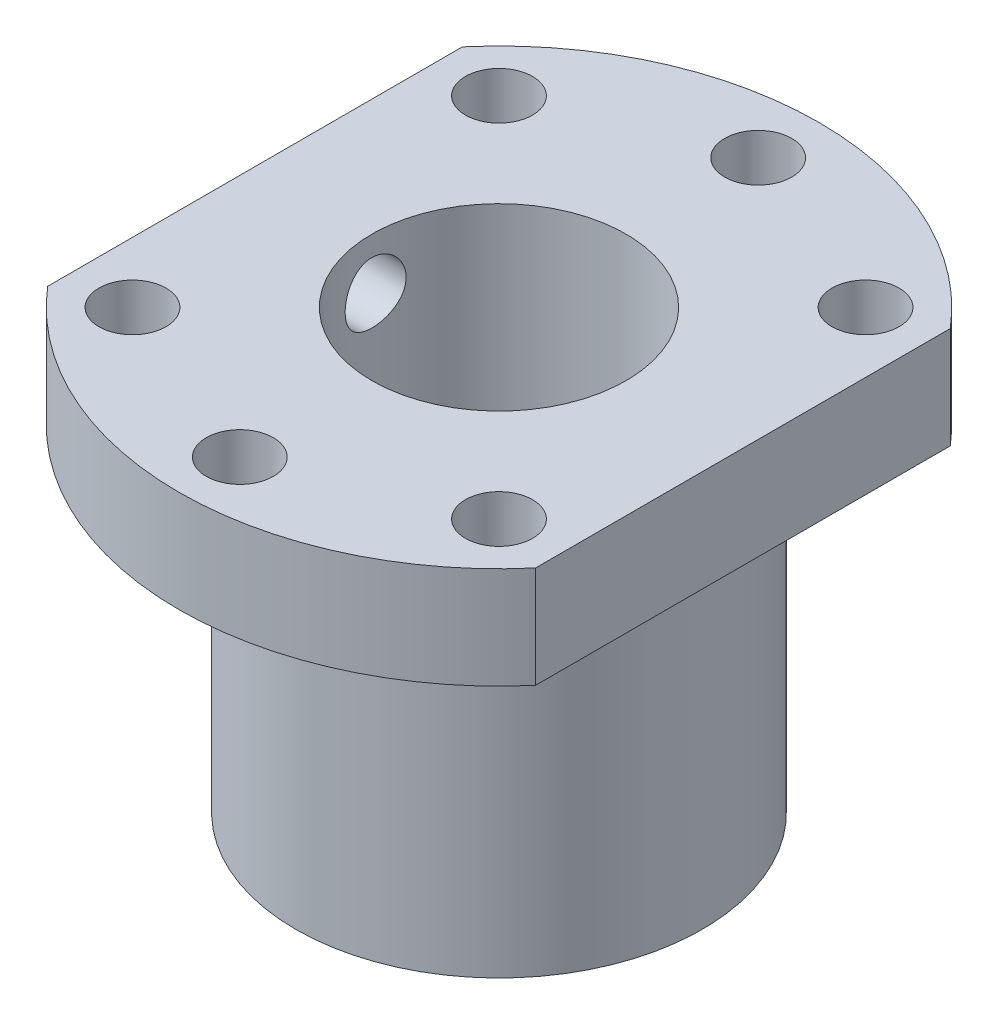
ISO-10303-21;
HEADER;
FILE_DESCRIPTION(('STEP AP214'),'2;1');
FILE_NAME('part.step','',(''),(''),'','','');
FILE_SCHEMA(('AUTOMOTIVE_DESIGN { 1 0 10303 214 1 1 1 1 }'));
ENDSEC;
DATA;
#1=APPLICATION_CONTEXT('core data for automotive mechanical design processes');
#2=APPLICATION_PROTOCOL_DEFINITION('international standard','automotive_design',2000,#1);
#3=PRODUCT_CONTEXT('',#1,'mechanical');
#4=PRODUCT('Part','Part','',(#3));
#5=PRODUCT_RELATED_PRODUCT_CATEGORY('part','',(#4));
#6=PRODUCT_DEFINITION_FORMATION('','',#4);
#7=PRODUCT_DEFINITION_CONTEXT('part definition',#1,'design');
#8=PRODUCT_DEFINITION('design','',#6,#7);
#9=PRODUCT_DEFINITION_SHAPE('','',#8);
#10=(LENGTH_UNIT() NAMED_UNIT(*) SI_UNIT(.MILLI.,.METRE.));
#11=(NAMED_UNIT(*) PLANE_ANGLE_UNIT() SI_UNIT($,.RADIAN.));
#12=(NAMED_UNIT(*) SI_UNIT($,.STERADIAN.) SOLID_ANGLE_UNIT());
#13=UNCERTAINTY_MEASURE_WITH_UNIT(LENGTH_MEASURE(1.E-05),#10,'distance_accuracy_value','');
#14=(GEOMETRIC_REPRESENTATION_CONTEXT(3) GLOBAL_UNCERTAINTY_ASSIGNED_CONTEXT((#13)) GLOBAL_UNIT_ASSIGNED_CONTEXT((#10,
#11,#12)) REPRESENTATION_CONTEXT('',''));
#15=CARTESIAN_POINT('',(0.,0.,0.));
#16=DIRECTION('',(0.,0.,1.));
#17=DIRECTION('',(1.,0.,0.));
#18=AXIS2_PLACEMENT_3D('',#15,#16,#17);
#19=CARTESIAN_POINT('',(0.,-10.,0.));
#20=DIRECTION('',(0.,1.,0.));
#21=DIRECTION('',(0.,0.,1.));
#22=AXIS2_PLACEMENT_3D('',#19,#20,#21);
#23=CYLINDRICAL_SURFACE('',#22,31.5);
#24=CARTESIAN_POINT('',(0.,0.,0.));
#25=DIRECTION('',(0.,1.,0.));
#26=DIRECTION('',(0.,0.,1.));
#27=AXIS2_PLACEMENT_3D('',#24,#25,#26);
#28=CIRCLE('',#27,31.5);
#29=CARTESIAN_POINT('',(24.,0.,-20.4022057631032));
#30=VERTEX_POINT('',#29);
#31=CARTESIAN_POINT('',(-24.,0.,-20.4022057631032));
#32=VERTEX_POINT('',#31);
#33=EDGE_CURVE('E106',#30,#32,#28,.T.);
#34=ORIENTED_EDGE('',*,*,#33,.F.);
#35=DIRECTION('',(0.,1.,0.));
#36=VECTOR('',#35,1.);
#37=CARTESIAN_POINT('',(24.,-10.,-20.4022057631032));
#38=LINE('',#37,#36);
#39=CARTESIAN_POINT('',(24.,-10.,-20.4022057631032));
#40=VERTEX_POINT('',#39);
#41=EDGE_CURVE('E11',#40,#30,#38,.T.);
#42=ORIENTED_EDGE('',*,*,#41,.F.);
#43=CARTESIAN_POINT('',(0.,-10.,0.));
#44=DIRECTION('',(0.,1.,0.));
#45=DIRECTION('',(0.,0.,1.));
#46=AXIS2_PLACEMENT_3D('',#43,#44,#45);
#47=CIRCLE('',#46,31.5);
#48=CARTESIAN_POINT('',(-24.,-10.,-20.4022057631032));
#49=VERTEX_POINT('',#48);
#50=EDGE_CURVE('E99',#40,#49,#47,.T.);
#51=ORIENTED_EDGE('',*,*,#50,.T.);
#52=DIRECTION('',(0.,1.,0.));
#53=VECTOR('',#52,1.);
#54=CARTESIAN_POINT('',(-24.,-10.,-20.4022057631032));
#55=LINE('',#54,#53);
#56=EDGE_CURVE('E82',#49,#32,#55,.T.);
#57=ORIENTED_EDGE('',*,*,#56,.T.);
#58=EDGE_LOOP('',(#34,#42,#51,#57));
#59=FACE_BOUND('',#58,.T.);
#60=ADVANCED_FACE('F34',(#59),#23,.T.);
#61=CARTESIAN_POINT('',(24.,-10.,-20.4022057631032));
#62=DIRECTION('',(1.,0.,0.));
#63=DIRECTION('',(0.,0.,-1.));
#64=AXIS2_PLACEMENT_3D('',#61,#62,#63);
#65=PLANE('',#64);
#66=DIRECTION('',(0.,0.,-1.));
#67=VECTOR('',#66,1.);
#68=CARTESIAN_POINT('',(24.,0.,-20.4022057631032));
#69=LINE('',#68,#67);
#70=CARTESIAN_POINT('',(24.,0.,20.4022057631032));
#71=VERTEX_POINT('',#70);
#72=EDGE_CURVE('E101',#71,#30,#69,.T.);
#73=ORIENTED_EDGE('',*,*,#72,.F.);
#74=DIRECTION('',(0.,1.,0.));
#75=VECTOR('',#74,1.);
#76=CARTESIAN_POINT('',(24.,-10.,20.4022057631032));
#77=LINE('',#76,#75);
#78=CARTESIAN_POINT('',(24.,-10.,20.4022057631032));
#79=VERTEX_POINT('',#78);
#80=EDGE_CURVE('E48',#79,#71,#77,.T.);
#81=ORIENTED_EDGE('',*,*,#80,.F.);
#82=DIRECTION('',(0.,0.,-1.));
#83=VECTOR('',#82,1.);
#84=CARTESIAN_POINT('',(24.,-10.,-20.4022057631032));
#85=LINE('',#84,#83);
#86=EDGE_CURVE('E96',#79,#40,#85,.T.);
#87=ORIENTED_EDGE('',*,*,#86,.T.);
#88=ORIENTED_EDGE('',*,*,#41,.T.);
#89=EDGE_LOOP('',(#73,#81,#87,#88));
#90=FACE_BOUND('',#89,.T.);
#91=ADVANCED_FACE('F118',(#90),#65,.T.);
#92=CARTESIAN_POINT('',(0.,-10.,0.));
#93=DIRECTION('',(0.,1.,0.));
#94=DIRECTION('',(0.,0.,1.));
#95=AXIS2_PLACEMENT_3D('',#92,#93,#94);
#96=CYLINDRICAL_SURFACE('',#95,31.5);
#97=CARTESIAN_POINT('',(0.,0.,0.));
#98=DIRECTION('',(0.,1.,0.));
#99=DIRECTION('',(0.,0.,1.));
#100=AXIS2_PLACEMENT_3D('',#97,#98,#99);
#101=CIRCLE('',#100,31.5);
#102=CARTESIAN_POINT('',(-24.,0.,20.4022057631032));
#103=VERTEX_POINT('',#102);
#104=EDGE_CURVE('E90',#103,#71,#101,.T.);
#105=ORIENTED_EDGE('',*,*,#104,.F.);
#106=DIRECTION('',(0.,1.,0.));
#107=VECTOR('',#106,1.);
#108=CARTESIAN_POINT('',(-24.,-10.,20.4022057631032));
#109=LINE('',#108,#107);
#110=CARTESIAN_POINT('',(-24.,-10.,20.4022057631032));
#111=VERTEX_POINT('',#110);
#112=EDGE_CURVE('E85',#111,#103,#109,.T.);
#113=ORIENTED_EDGE('',*,*,#112,.F.);
#114=CARTESIAN_POINT('',(0.,-10.,0.));
#115=DIRECTION('',(0.,1.,0.));
#116=DIRECTION('',(0.,0.,1.));
#117=AXIS2_PLACEMENT_3D('',#114,#115,#116);
#118=CIRCLE('',#117,31.5);
#119=EDGE_CURVE('E88',#111,#79,#118,.T.);
#120=ORIENTED_EDGE('',*,*,#119,.T.);
#121=ORIENTED_EDGE('',*,*,#80,.T.);
#122=EDGE_LOOP('',(#105,#113,#120,#121));
#123=FACE_BOUND('',#122,.T.);
#124=ADVANCED_FACE('F87',(#123),#96,.T.);
#125=CARTESIAN_POINT('',(-24.,-10.,-20.4022057631032));
#126=DIRECTION('',(-1.,0.,0.));
#127=DIRECTION('',(0.,0.,1.));
#128=AXIS2_PLACEMENT_3D('',#125,#126,#127);
#129=PLANE('',#128);
#130=CARTESIAN_POINT('',(-24.,-5.,0.));
#131=DIRECTION('',(1.,0.,0.));
#132=DIRECTION('',(0.,0.,-1.));
#133=AXIS2_PLACEMENT_3D('',#130,#131,#132);
#134=CIRCLE('',#133,3.);
#135=CARTESIAN_POINT('',(-24.,-5.,-3.));
#136=VERTEX_POINT('',#135);
#137=EDGE_CURVE('E136',#136,#136,#134,.T.);
#138=ORIENTED_EDGE('',*,*,#137,.T.);
#139=EDGE_LOOP('',(#138));
#140=FACE_BOUND('',#139,.T.);
#141=DIRECTION('',(0.,0.,1.));
#142=VECTOR('',#141,1.);
#143=CARTESIAN_POINT('',(-24.,0.,-20.4022057631032));
#144=LINE('',#143,#142);
#145=EDGE_CURVE('E109',#32,#103,#144,.T.);
#146=ORIENTED_EDGE('',*,*,#145,.F.);
#147=ORIENTED_EDGE('',*,*,#56,.F.);
#148=DIRECTION('',(0.,0.,1.));
#149=VECTOR('',#148,1.);
#150=CARTESIAN_POINT('',(-24.,-10.,-20.4022057631032));
#151=LINE('',#150,#149);
#152=EDGE_CURVE('E95',#49,#111,#151,.T.);
#153=ORIENTED_EDGE('',*,*,#152,.T.);
#154=ORIENTED_EDGE('',*,*,#112,.T.);
#155=EDGE_LOOP('',(#146,#147,#153,#154));
#156=FACE_BOUND('',#155,.T.);
#157=ADVANCED_FACE('F98',(#140,#156),#129,.T.);
#158=CARTESIAN_POINT('',(0.,-10.,0.));
#159=DIRECTION('',(0.,1.,0.));
#160=DIRECTION('',(0.,0.,1.));
#161=AXIS2_PLACEMENT_3D('',#158,#159,#160);
#162=PLANE('',#161);
#163=CARTESIAN_POINT('',(0.,-10.,-25.5));
#164=DIRECTION('',(0.,1.,0.));
#165=DIRECTION('',(0.,0.,1.));
#166=AXIS2_PLACEMENT_3D('',#163,#164,#165);
#167=CIRCLE('',#166,3.3);
#168=CARTESIAN_POINT('',(0.,-10.,-22.2));
#169=VERTEX_POINT('',#168);
#170=EDGE_CURVE('E174',#169,#169,#167,.T.);
#171=ORIENTED_EDGE('',*,*,#170,.T.);
#172=EDGE_LOOP('',(#171));
#173=FACE_BOUND('',#172,.T.);
#174=CARTESIAN_POINT('',(-18.031222920257,-10.,-18.0312229202569));
#175=DIRECTION('',(0.,1.,0.));
#176=DIRECTION('',(0.,0.,1.));
#177=AXIS2_PLACEMENT_3D('',#174,#175,#176);
#178=CIRCLE('',#177,3.3);
#179=CARTESIAN_POINT('',(-18.031222920257,-10.,-14.7312229202569));
#180=VERTEX_POINT('',#179);
#181=EDGE_CURVE('E171',#180,#180,#178,.T.);
#182=ORIENTED_EDGE('',*,*,#181,.T.);
#183=EDGE_LOOP('',(#182));
#184=FACE_BOUND('',#183,.T.);
#185=CARTESIAN_POINT('',(18.031222920257,-10.,-18.0312229202569));
#186=DIRECTION('',(0.,1.,0.));
#187=DIRECTION('',(0.,0.,1.));
#188=AXIS2_PLACEMENT_3D('',#185,#186,#187);
#189=CIRCLE('',#188,3.3);
#190=CARTESIAN_POINT('',(18.031222920257,-10.,-14.7312229202569));
#191=VERTEX_POINT('',#190);
#192=EDGE_CURVE('E168',#191,#191,#189,.T.);
#193=ORIENTED_EDGE('',*,*,#192,.T.);
#194=EDGE_LOOP('',(#193));
#195=FACE_BOUND('',#194,.T.);
#196=CARTESIAN_POINT('',(18.031222920257,-10.,18.0312229202569));
#197=DIRECTION('',(0.,1.,0.));
#198=DIRECTION('',(0.,0.,1.));
#199=AXIS2_PLACEMENT_3D('',#196,#197,#198);
#200=CIRCLE('',#199,3.3);
#201=CARTESIAN_POINT('',(18.031222920257,-10.,21.3312229202569));
#202=VERTEX_POINT('',#201);
#203=EDGE_CURVE('E165',#202,#202,#200,.T.);
#204=ORIENTED_EDGE('',*,*,#203,.T.);
#205=EDGE_LOOP('',(#204));
#206=FACE_BOUND('',#205,.T.);
#207=CARTESIAN_POINT('',(-18.031222920257,-10.,18.0312229202569));
#208=DIRECTION('',(0.,1.,0.));
#209=DIRECTION('',(0.,0.,1.));
#210=AXIS2_PLACEMENT_3D('',#207,#208,#209);
#211=CIRCLE('',#210,3.3);
#212=CARTESIAN_POINT('',(-18.031222920257,-10.,21.3312229202569));
#213=VERTEX_POINT('',#212);
#214=EDGE_CURVE('E162',#213,#213,#211,.T.);
#215=ORIENTED_EDGE('',*,*,#214,.T.);
#216=EDGE_LOOP('',(#215));
#217=FACE_BOUND('',#216,.T.);
#218=CARTESIAN_POINT('',(0.,-10.,25.5));
#219=DIRECTION('',(0.,1.,0.));
#220=DIRECTION('',(0.,0.,1.));
#221=AXIS2_PLACEMENT_3D('',#218,#219,#220);
#222=CIRCLE('',#221,3.3);
#223=CARTESIAN_POINT('',(0.,-10.,28.8));
#224=VERTEX_POINT('',#223);
#225=EDGE_CURVE('E145',#224,#224,#222,.T.);
#226=ORIENTED_EDGE('',*,*,#225,.T.);
#227=EDGE_LOOP('',(#226));
#228=FACE_BOUND('',#227,.T.);
#229=CARTESIAN_POINT('',(0.,-10.,0.));
#230=DIRECTION('',(0.,1.,0.));
#231=DIRECTION('',(0.,0.,1.));
#232=AXIS2_PLACEMENT_3D('',#229,#230,#231);
#233=CIRCLE('',#232,20.);
#234=CARTESIAN_POINT('',(0.,-10.,20.));
#235=VERTEX_POINT('',#234);
#236=EDGE_CURVE('E183',#235,#235,#233,.T.);
#237=ORIENTED_EDGE('',*,*,#236,.T.);
#238=EDGE_LOOP('',(#237));
#239=FACE_BOUND('',#238,.T.);
#240=ORIENTED_EDGE('',*,*,#50,.F.);
#241=ORIENTED_EDGE('',*,*,#86,.F.);
#242=ORIENTED_EDGE('',*,*,#119,.F.);
#243=ORIENTED_EDGE('',*,*,#152,.F.);
#244=EDGE_LOOP('',(#240,#241,#242,#243));
#245=FACE_BOUND('',#244,.T.);
#246=ADVANCED_FACE('F94',(#173,#184,#195,#206,#217,#228,#239,#245),#162,.F.);
#247=CARTESIAN_POINT('',(0.,0.,0.));
#248=DIRECTION('',(0.,1.,0.));
#249=DIRECTION('',(0.,0.,1.));
#250=AXIS2_PLACEMENT_3D('',#247,#248,#249);
#251=PLANE('',#250);
#252=CARTESIAN_POINT('',(0.,0.,-25.5));
#253=DIRECTION('',(0.,1.,0.));
#254=DIRECTION('',(0.,0.,1.));
#255=AXIS2_PLACEMENT_3D('',#252,#253,#254);
#256=CIRCLE('',#255,3.3);
#257=CARTESIAN_POINT('',(0.,0.,-22.2));
#258=VERTEX_POINT('',#257);
#259=EDGE_CURVE('E142',#258,#258,#256,.T.);
#260=ORIENTED_EDGE('',*,*,#259,.F.);
#261=EDGE_LOOP('',(#260));
#262=FACE_BOUND('',#261,.T.);
#263=CARTESIAN_POINT('',(-18.031222920257,0.,-18.0312229202569));
#264=DIRECTION('',(0.,1.,0.));
#265=DIRECTION('',(0.,0.,1.));
#266=AXIS2_PLACEMENT_3D('',#263,#264,#265);
#267=CIRCLE('',#266,3.3);
#268=CARTESIAN_POINT('',(-18.031222920257,0.,-14.7312229202569));
#269=VERTEX_POINT('',#268);
#270=EDGE_CURVE('E146',#269,#269,#267,.T.);
#271=ORIENTED_EDGE('',*,*,#270,.F.);
#272=EDGE_LOOP('',(#271));
#273=FACE_BOUND('',#272,.T.);
#274=CARTESIAN_POINT('',(18.031222920257,0.,-18.0312229202569));
#275=DIRECTION('',(0.,1.,0.));
#276=DIRECTION('',(0.,0.,1.));
#277=AXIS2_PLACEMENT_3D('',#274,#275,#276);
#278=CIRCLE('',#277,3.3);
#279=CARTESIAN_POINT('',(18.031222920257,0.,-14.7312229202569));
#280=VERTEX_POINT('',#279);
#281=EDGE_CURVE('E149',#280,#280,#278,.T.);
#282=ORIENTED_EDGE('',*,*,#281,.F.);
#283=EDGE_LOOP('',(#282));
#284=FACE_BOUND('',#283,.T.);
#285=CARTESIAN_POINT('',(18.031222920257,0.,18.0312229202569));
#286=DIRECTION('',(0.,1.,0.));
#287=DIRECTION('',(0.,0.,-1.));
#288=AXIS2_PLACEMENT_3D('',#285,#286,#287);
#289=CIRCLE('',#288,3.3);
#290=CARTESIAN_POINT('',(18.031222920257,0.,14.7312229202569));
#291=VERTEX_POINT('',#290);
#292=EDGE_CURVE('E152',#291,#291,#289,.T.);
#293=ORIENTED_EDGE('',*,*,#292,.F.);
#294=EDGE_LOOP('',(#293));
#295=FACE_BOUND('',#294,.T.);
#296=CARTESIAN_POINT('',(-18.031222920257,0.,18.0312229202569));
#297=DIRECTION('',(0.,1.,0.));
#298=DIRECTION('',(0.,0.,-1.));
#299=AXIS2_PLACEMENT_3D('',#296,#297,#298);
#300=CIRCLE('',#299,3.3);
#301=CARTESIAN_POINT('',(-18.031222920257,0.,14.7312229202569));
#302=VERTEX_POINT('',#301);
#303=EDGE_CURVE('E155',#302,#302,#300,.T.);
#304=ORIENTED_EDGE('',*,*,#303,.F.);
#305=EDGE_LOOP('',(#304));
#306=FACE_BOUND('',#305,.T.);
#307=CARTESIAN_POINT('',(0.,0.,25.5));
#308=DIRECTION('',(0.,1.,0.));
#309=DIRECTION('',(0.,0.,-1.));
#310=AXIS2_PLACEMENT_3D('',#307,#308,#309);
#311=CIRCLE('',#310,3.3);
#312=CARTESIAN_POINT('',(0.,0.,22.2));
#313=VERTEX_POINT('',#312);
#314=EDGE_CURVE('E140',#313,#313,#311,.T.);
#315=ORIENTED_EDGE('',*,*,#314,.F.);
#316=EDGE_LOOP('',(#315));
#317=FACE_BOUND('',#316,.T.);
#318=ORIENTED_EDGE('',*,*,#33,.T.);
#319=ORIENTED_EDGE('',*,*,#145,.T.);
#320=ORIENTED_EDGE('',*,*,#104,.T.);
#321=ORIENTED_EDGE('',*,*,#72,.T.);
#322=EDGE_LOOP('',(#318,#319,#320,#321));
#323=FACE_BOUND('',#322,.T.);
#324=CARTESIAN_POINT('',(0.,0.,0.));
#325=DIRECTION('',(0.,1.,0.));
#326=DIRECTION('',(0.,0.,1.));
#327=AXIS2_PLACEMENT_3D('',#324,#325,#326);
#328=CIRCLE('',#327,12.5);
#329=CARTESIAN_POINT('',(0.,0.,12.5));
#330=VERTEX_POINT('',#329);
#331=EDGE_CURVE('E110',#330,#330,#328,.T.);
#332=ORIENTED_EDGE('',*,*,#331,.F.);
#333=EDGE_LOOP('',(#332));
#334=FACE_BOUND('',#333,.T.);
#335=ADVANCED_FACE('F116',(#262,#273,#284,#295,#306,#317,#323,#334),#251,.T.);
#336=CARTESIAN_POINT('',(0.,-10.,0.));
#337=DIRECTION('',(0.,1.,0.));
#338=DIRECTION('',(0.,0.,1.));
#339=AXIS2_PLACEMENT_3D('',#336,#337,#338);
#340=CYLINDRICAL_SURFACE('',#339,12.5);
#341=CARTESIAN_POINT('',(-12.1346610995116,-5.,-3.));
#342=CARTESIAN_POINT('',(-12.1346643709057,-5.16588631394364,-2.99999492639599));
#343=CARTESIAN_POINT('',(-12.1380998279897,-5.33183030182244,-2.98619401575549));
#344=CARTESIAN_POINT('',(-12.1514386999622,-5.65896835271962,-2.93143372377318));
#345=CARTESIAN_POINT('',(-12.1613461803941,-5.82015936348798,-2.89045727127241));
#346=CARTESIAN_POINT('',(-12.1864438536979,-6.13301229540291,-2.78273587845348));
#347=CARTESIAN_POINT('',(-12.2016275682829,-6.28468563419401,-2.71602252749926));
#348=CARTESIAN_POINT('',(-12.2355589227548,-6.57469954365719,-2.55881551789466));
#349=CARTESIAN_POINT('',(-12.2543066403104,-6.71303982366955,-2.46832134098417));
#350=CARTESIAN_POINT('',(-12.2936793084446,-6.97526881494018,-2.26416092165145));
#351=CARTESIAN_POINT('',(-12.3143323081787,-7.09884715598952,-2.15010136587795));
#352=CARTESIAN_POINT('',(-12.3549444196641,-7.32531539443417,-1.90289576315871));
#353=CARTESIAN_POINT('',(-12.3749034702238,-7.42820347119262,-1.7697480383165));
#354=CARTESIAN_POINT('',(-12.4121875957975,-7.61162643270601,-1.48603435008244));
#355=CARTESIAN_POINT('',(-12.429475709008,-7.69185852354929,-1.33526735140698));
#356=CARTESIAN_POINT('',(-12.4591511096292,-7.82572653731784,-1.0219036434405));
#357=CARTESIAN_POINT('',(-12.471539061815,-7.87936606814533,-0.859308542342424));
#358=CARTESIAN_POINT('',(-12.4898200905274,-7.95753815438648,-0.53013715279891));
#359=CARTESIAN_POINT('',(-12.4958305032045,-7.98259721420821,-0.363692527540999));
#360=CARTESIAN_POINT('',(-12.5010873481438,-8.00454751969164,-0.0288605739758586));
#361=CARTESIAN_POINT('',(-12.5003347050497,-8.00144261592415,0.139526485618309));
#362=CARTESIAN_POINT('',(-12.4922383642801,-7.96753629921501,0.469819197188795));
#363=CARTESIAN_POINT('',(-12.4850298487431,-7.93730291583144,0.631786969117105));
#364=CARTESIAN_POINT('',(-12.4649879597451,-7.85090826203714,0.948279915829272));
#365=CARTESIAN_POINT('',(-12.4521543006312,-7.79474567489715,1.10280471220598));
#366=CARTESIAN_POINT('',(-12.4220937673228,-7.65761316725222,1.40154850796015));
#367=CARTESIAN_POINT('',(-12.4048305309055,-7.57643674423159,1.54566890739797));
#368=CARTESIAN_POINT('',(-12.3677903650575,-7.39173656633371,1.81844374815069));
#369=CARTESIAN_POINT('',(-12.3480130295253,-7.28820919922672,1.94709568430373));
#370=CARTESIAN_POINT('',(-12.307523454591,-7.0586845989154,2.18866676072892));
#371=CARTESIAN_POINT('',(-12.2868002024656,-6.93219063383104,2.30111257110784));
#372=CARTESIAN_POINT('',(-12.247210122564,-6.66192436384159,2.50329554889259));
#373=CARTESIAN_POINT('',(-12.2283433682075,-6.51815137609684,2.59303181841776));
#374=CARTESIAN_POINT('',(-12.1945661246798,-6.21653474373689,2.74751986313759));
#375=CARTESIAN_POINT('',(-12.1796724534131,-6.05863494892363,2.81216594132899));
#376=CARTESIAN_POINT('',(-12.155748323081,-5.73376687652317,2.91385324316721));
#377=CARTESIAN_POINT('',(-12.1467167199581,-5.56680037531667,2.95089985341171));
#378=CARTESIAN_POINT('',(-12.1357772660229,-5.23290661993213,2.99556850234642));
#379=CARTESIAN_POINT('',(-12.1337008786289,-5.06607792748918,3.0038868332891));
#380=CARTESIAN_POINT('',(-12.1364495609797,-4.7334168059252,2.99276203410493));
#381=CARTESIAN_POINT('',(-12.1412740503119,-4.56758429419628,2.97332123871795));
#382=CARTESIAN_POINT('',(-12.1571201522343,-4.24415408273907,2.90783852027801));
#383=CARTESIAN_POINT('',(-12.1680489760353,-4.08647082408308,2.86219461484814));
#384=CARTESIAN_POINT('',(-12.1947857126682,-3.78099217933293,2.74603914988784));
#385=CARTESIAN_POINT('',(-12.2105941678427,-3.6331978945637,2.6755248260303));
#386=CARTESIAN_POINT('',(-12.2456689266469,-3.34872124779605,2.51014743676235));
#387=CARTESIAN_POINT('',(-12.2649930224287,-3.21229062599396,2.41486385815303));
#388=CARTESIAN_POINT('',(-12.3047764880024,-2.95709926610609,2.2031905161038));
#389=CARTESIAN_POINT('',(-12.3252360287629,-2.83834119901455,2.08679756812263));
#390=CARTESIAN_POINT('',(-12.3655511140332,-2.61908499039076,1.8330286051264));
#391=CARTESIAN_POINT('',(-12.3853821651221,-2.51906624401033,1.69523379949056));
#392=CARTESIAN_POINT('',(-12.4217193399952,-2.34359153691497,1.40439761806721));
#393=CARTESIAN_POINT('',(-12.438225632785,-2.26813432755534,1.25135701785302));
#394=CARTESIAN_POINT('',(-12.4659520953338,-2.14455252272497,0.935406182533394));
#395=CARTESIAN_POINT('',(-12.4772089625634,-2.09623767947837,0.772573732033523));
#396=CARTESIAN_POINT('',(-12.4933282808784,-2.02773217960314,0.44079751662121));
#397=CARTESIAN_POINT('',(-12.4981918632553,-2.00753654724451,0.271854838350957));
#398=CARTESIAN_POINT('',(-12.5009346170348,-1.99610413221297,-0.0628273325379071));
#399=CARTESIAN_POINT('',(-12.4989850590467,-2.0041572440584,-0.228541548592049));
#400=CARTESIAN_POINT('',(-12.4886960978661,-2.04737996301755,-0.556181588106272));
#401=CARTESIAN_POINT('',(-12.4803568581455,-2.08254887640871,-0.718107508375784));
#402=CARTESIAN_POINT('',(-12.4582475403262,-2.17863682511571,-1.03289533638029));
#403=CARTESIAN_POINT('',(-12.4445026408745,-2.23943656944082,-1.18579554017999));
#404=CARTESIAN_POINT('',(-12.4130357959962,-2.3849502441486,-1.47930912419136));
#405=CARTESIAN_POINT('',(-12.3953133850962,-2.46966697374628,-1.61992106367531));
#406=CARTESIAN_POINT('',(-12.3573152907204,-2.66282547427691,-1.88826701153781));
#407=CARTESIAN_POINT('',(-12.3369914041701,-2.77175507074358,-2.01564306622629));
#408=CARTESIAN_POINT('',(-12.2963112747441,-3.00928761058973,-2.25054951565269));
#409=CARTESIAN_POINT('',(-12.2759550250775,-3.13789544073631,-2.35807496614236));
#410=CARTESIAN_POINT('',(-12.2371275634283,-3.41373939416014,-2.55199485185679));
#411=CARTESIAN_POINT('',(-12.2186938455572,-3.561252620507,-2.63800316633773));
#412=CARTESIAN_POINT('',(-12.1862909651906,-3.86906184650554,-2.78387070894251));
#413=CARTESIAN_POINT('',(-12.1723183758181,-4.02934791567107,-2.84375002144868));
#414=CARTESIAN_POINT('',(-12.1527391085338,-4.32459285351408,-2.92614436386637));
#415=CARTESIAN_POINT('',(-12.1460087939348,-4.4580708282112,-2.95378236710749));
#416=CARTESIAN_POINT('',(-12.1369686046644,-4.7276863740708,-2.99071161192546));
#417=CARTESIAN_POINT('',(-12.1346584140208,-4.86382375442303,-3.00000416492674));
#418=CARTESIAN_POINT('',(-12.1346610995116,-5.,-3.));
#419=B_SPLINE_CURVE_WITH_KNOTS('',3,(#341,#342,#343,#344,#345,#346,#347,#348,#349,#350,#351,
#352,#353,#354,#355,#356,#357,#358,#359,#360,#361,#362,#363,#364,#365,#366,#367,#368,#369,#370,
#371,#372,#373,#374,#375,#376,#377,#378,#379,#380,#381,#382,#383,#384,#385,#386,#387,#388,#389,
#390,#391,#392,#393,#394,#395,#396,#397,#398,#399,#400,#401,#402,#403,#404,#405,#406,#407,#408,
#409,#410,#411,#412,#413,#414,#415,#416,#417,#418),.UNSPECIFIED.,.T.,.F.,(4,2,2,2,2,2,2,2,2,2,2,
2,2,2,2,2,2,2,2,2,2,2,2,2,2,2,2,2,2,2,2,2,2,2,2,2,2,2,4),(0.,0.497159212189433,0.9946310265389,
1.49149417875255,1.98836816009861,2.49432418194046,3.00032470584734,3.51279830766303,
4.02520236141813,4.52800628486068,5.03074146609936,5.52318961529222,6.01566277459448,
6.51231571921414,7.00904899016388,7.51819168467208,8.02735450631452,8.5386395722652,
9.04982482437227,9.54852995993759,10.047193153326,10.5384749824062,11.0298114342859,
11.5301065260644,12.0304771548043,12.5422844123508,13.0540656468818,13.5622134292334,
14.0702712827588,14.5656502933719,15.0610166307768,15.5541024543049,16.047246011943,
16.5514085771014,17.0556965465884,17.56847227941,18.0808531634825,18.4890008491296,
18.8971193572843),.UNSPECIFIED.);
#420=CARTESIAN_POINT('',(-12.1346610995116,-5.,-3.));
#421=VERTEX_POINT('',#420);
#422=EDGE_CURVE('E37',#421,#421,#419,.T.);
#423=ORIENTED_EDGE('',*,*,#422,.T.);
#424=EDGE_LOOP('',(#423));
#425=FACE_BOUND('',#424,.T.);
#426=ORIENTED_EDGE('',*,*,#331,.T.);
#427=EDGE_LOOP('',(#426));
#428=FACE_BOUND('',#427,.T.);
#429=CARTESIAN_POINT('',(0.,-43.,0.));
#430=DIRECTION('',(0.,1.,0.));
#431=DIRECTION('',(0.,0.,1.));
#432=AXIS2_PLACEMENT_3D('',#429,#430,#431);
#433=CIRCLE('',#432,12.5);
#434=CARTESIAN_POINT('',(0.,-43.,12.5));
#435=VERTEX_POINT('',#434);
#436=EDGE_CURVE('E177',#435,#435,#433,.T.);
#437=ORIENTED_EDGE('',*,*,#436,.F.);
#438=EDGE_LOOP('',(#437));
#439=FACE_BOUND('',#438,.T.);
#440=ADVANCED_FACE('F188',(#425,#428,#439),#340,.F.);
#441=CARTESIAN_POINT('',(0.,-43.,0.));
#442=DIRECTION('',(0.,1.,0.));
#443=DIRECTION('',(0.,0.,1.));
#444=AXIS2_PLACEMENT_3D('',#441,#442,#443);
#445=CYLINDRICAL_SURFACE('',#444,20.);
#446=CARTESIAN_POINT('',(0.,-43.,0.));
#447=DIRECTION('',(0.,1.,0.));
#448=DIRECTION('',(0.,0.,1.));
#449=AXIS2_PLACEMENT_3D('',#446,#447,#448);
#450=CIRCLE('',#449,20.);
#451=CARTESIAN_POINT('',(0.,-43.,20.));
#452=VERTEX_POINT('',#451);
#453=EDGE_CURVE('E180',#452,#452,#450,.T.);
#454=ORIENTED_EDGE('',*,*,#453,.T.);
#455=EDGE_LOOP('',(#454));
#456=FACE_BOUND('',#455,.T.);
#457=ORIENTED_EDGE('',*,*,#236,.F.);
#458=EDGE_LOOP('',(#457));
#459=FACE_BOUND('',#458,.T.);
#460=ADVANCED_FACE('F195',(#456,#459),#445,.T.);
#461=CARTESIAN_POINT('',(0.,-43.,0.));
#462=DIRECTION('',(0.,1.,0.));
#463=DIRECTION('',(0.,0.,1.));
#464=AXIS2_PLACEMENT_3D('',#461,#462,#463);
#465=PLANE('',#464);
#466=ORIENTED_EDGE('',*,*,#436,.T.);
#467=EDGE_LOOP('',(#466));
#468=FACE_BOUND('',#467,.T.);
#469=ORIENTED_EDGE('',*,*,#453,.F.);
#470=EDGE_LOOP('',(#469));
#471=FACE_BOUND('',#470,.T.);
#472=ADVANCED_FACE('F213',(#468,#471),#465,.F.);
#473=CARTESIAN_POINT('',(0.,-43.,25.5));
#474=DIRECTION('',(0.,1.,0.));
#475=DIRECTION('',(0.,0.,1.));
#476=AXIS2_PLACEMENT_3D('',#473,#474,#475);
#477=CYLINDRICAL_SURFACE('',#476,3.3);
#478=ORIENTED_EDGE('',*,*,#314,.T.);
#479=EDGE_LOOP('',(#478));
#480=FACE_BOUND('',#479,.T.);
#481=ORIENTED_EDGE('',*,*,#225,.F.);
#482=EDGE_LOOP('',(#481));
#483=FACE_BOUND('',#482,.T.);
#484=ADVANCED_FACE('F209',(#480,#483),#477,.F.);
#485=CARTESIAN_POINT('',(-18.031222920257,-43.,18.0312229202569));
#486=DIRECTION('',(0.,1.,0.));
#487=DIRECTION('',(0.,0.,1.));
#488=AXIS2_PLACEMENT_3D('',#485,#486,#487);
#489=CYLINDRICAL_SURFACE('',#488,3.3);
#490=ORIENTED_EDGE('',*,*,#303,.T.);
#491=EDGE_LOOP('',(#490));
#492=FACE_BOUND('',#491,.T.);
#493=ORIENTED_EDGE('',*,*,#214,.F.);
#494=EDGE_LOOP('',(#493));
#495=FACE_BOUND('',#494,.T.);
#496=ADVANCED_FACE('F212',(#492,#495),#489,.F.);
#497=CARTESIAN_POINT('',(18.031222920257,-43.,18.0312229202569));
#498=DIRECTION('',(0.,1.,0.));
#499=DIRECTION('',(0.,0.,1.));
#500=AXIS2_PLACEMENT_3D('',#497,#498,#499);
#501=CYLINDRICAL_SURFACE('',#500,3.3);
#502=ORIENTED_EDGE('',*,*,#292,.T.);
#503=EDGE_LOOP('',(#502));
#504=FACE_BOUND('',#503,.T.);
#505=ORIENTED_EDGE('',*,*,#203,.F.);
#506=EDGE_LOOP('',(#505));
#507=FACE_BOUND('',#506,.T.);
#508=ADVANCED_FACE('F232',(#504,#507),#501,.F.);
#509=CARTESIAN_POINT('',(18.031222920257,-43.,-18.0312229202569));
#510=DIRECTION('',(0.,1.,0.));
#511=DIRECTION('',(0.,0.,1.));
#512=AXIS2_PLACEMENT_3D('',#509,#510,#511);
#513=CYLINDRICAL_SURFACE('',#512,3.3);
#514=ORIENTED_EDGE('',*,*,#281,.T.);
#515=EDGE_LOOP('',(#514));
#516=FACE_BOUND('',#515,.T.);
#517=ORIENTED_EDGE('',*,*,#192,.F.);
#518=EDGE_LOOP('',(#517));
#519=FACE_BOUND('',#518,.T.);
#520=ADVANCED_FACE('F236',(#516,#519),#513,.F.);
#521=CARTESIAN_POINT('',(-18.031222920257,-43.,-18.0312229202569));
#522=DIRECTION('',(0.,1.,0.));
#523=DIRECTION('',(0.,0.,1.));
#524=AXIS2_PLACEMENT_3D('',#521,#522,#523);
#525=CYLINDRICAL_SURFACE('',#524,3.3);
#526=ORIENTED_EDGE('',*,*,#270,.T.);
#527=EDGE_LOOP('',(#526));
#528=FACE_BOUND('',#527,.T.);
#529=ORIENTED_EDGE('',*,*,#181,.F.);
#530=EDGE_LOOP('',(#529));
#531=FACE_BOUND('',#530,.T.);
#532=ADVANCED_FACE('F240',(#528,#531),#525,.F.);
#533=CARTESIAN_POINT('',(0.,-43.,-25.5));
#534=DIRECTION('',(0.,1.,0.));
#535=DIRECTION('',(0.,0.,1.));
#536=AXIS2_PLACEMENT_3D('',#533,#534,#535);
#537=CYLINDRICAL_SURFACE('',#536,3.3);
#538=ORIENTED_EDGE('',*,*,#259,.T.);
#539=EDGE_LOOP('',(#538));
#540=FACE_BOUND('',#539,.T.);
#541=ORIENTED_EDGE('',*,*,#170,.F.);
#542=EDGE_LOOP('',(#541));
#543=FACE_BOUND('',#542,.T.);
#544=ADVANCED_FACE('F244',(#540,#543),#537,.F.);
#545=CARTESIAN_POINT('',(-24.,-5.,0.));
#546=DIRECTION('',(1.,0.,0.));
#547=DIRECTION('',(0.,0.,-1.));
#548=AXIS2_PLACEMENT_3D('',#545,#546,#547);
#549=CYLINDRICAL_SURFACE('',#548,3.);
#550=ORIENTED_EDGE('',*,*,#137,.F.);
#551=EDGE_LOOP('',(#550));
#552=FACE_BOUND('',#551,.T.);
#553=ORIENTED_EDGE('',*,*,#422,.F.);
#554=EDGE_LOOP('',(#553));
#555=FACE_BOUND('',#554,.T.);
#556=ADVANCED_FACE('F247',(#552,#555),#549,.F.);
#557=CLOSED_SHELL('',(#60,#91,#124,#157,#246,#335,#440,#460,#472,#484,#496,#508,#520,#532,#544,#556));
#558=MANIFOLD_SOLID_BREP('B2',#557);
#559=ADVANCED_BREP_SHAPE_REPRESENTATION('',(#18,#558),#14);
#560=SHAPE_DEFINITION_REPRESENTATION(#9,#559);
ENDSEC;
END-ISO-10303-21;
